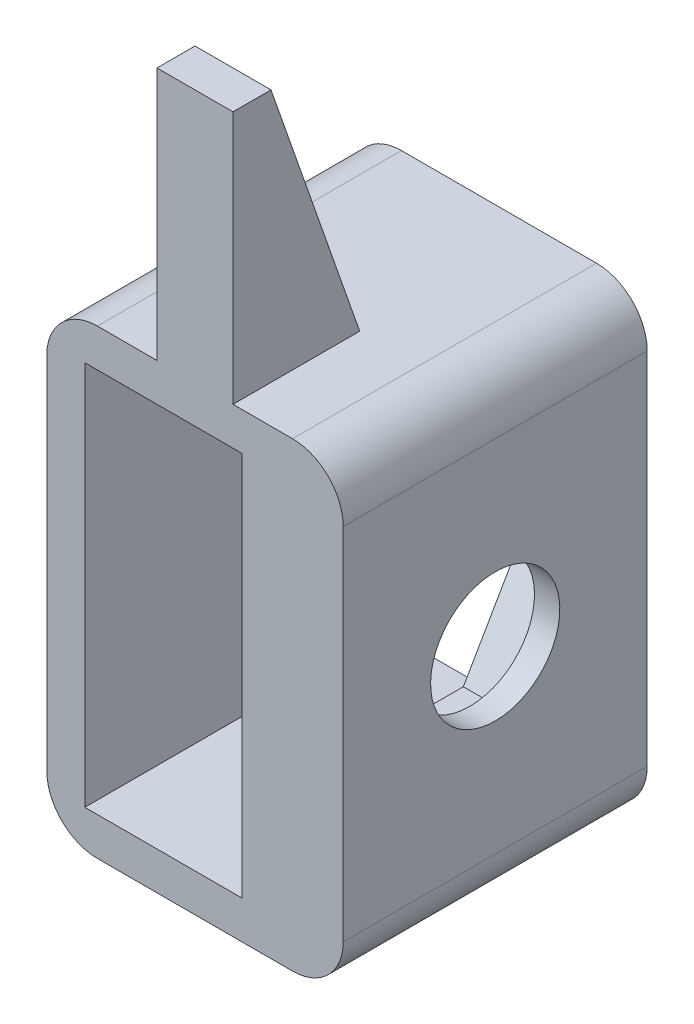
ISO-10303-21;
HEADER;
FILE_DESCRIPTION(('STEP AP214'),'2;1');
FILE_NAME('part.step','',(''),(''),'','','');
FILE_SCHEMA(('AUTOMOTIVE_DESIGN { 1 0 10303 214 1 1 1 1 }'));
ENDSEC;
DATA;
#1=APPLICATION_CONTEXT('core data for automotive mechanical design processes');
#2=APPLICATION_PROTOCOL_DEFINITION('international standard','automotive_design',2000,#1);
#3=PRODUCT_CONTEXT('',#1,'mechanical');
#4=PRODUCT('Part','Part','',(#3));
#5=PRODUCT_RELATED_PRODUCT_CATEGORY('part','',(#4));
#6=PRODUCT_DEFINITION_FORMATION('','',#4);
#7=PRODUCT_DEFINITION_CONTEXT('part definition',#1,'design');
#8=PRODUCT_DEFINITION('design','',#6,#7);
#9=PRODUCT_DEFINITION_SHAPE('','',#8);
#10=(LENGTH_UNIT() NAMED_UNIT(*) SI_UNIT(.MILLI.,.METRE.));
#11=(NAMED_UNIT(*) PLANE_ANGLE_UNIT() SI_UNIT($,.RADIAN.));
#12=(NAMED_UNIT(*) SI_UNIT($,.STERADIAN.) SOLID_ANGLE_UNIT());
#13=UNCERTAINTY_MEASURE_WITH_UNIT(LENGTH_MEASURE(1.E-05),#10,'distance_accuracy_value','');
#14=(GEOMETRIC_REPRESENTATION_CONTEXT(3) GLOBAL_UNCERTAINTY_ASSIGNED_CONTEXT((#13)) GLOBAL_UNIT_ASSIGNED_CONTEXT((#10,
#11,#12)) REPRESENTATION_CONTEXT('',''));
#15=CARTESIAN_POINT('',(0.,0.,0.));
#16=DIRECTION('',(0.,0.,1.));
#17=DIRECTION('',(1.,0.,0.));
#18=AXIS2_PLACEMENT_3D('',#15,#16,#17);
#19=CARTESIAN_POINT('',(-4.6,9.1,12.));
#20=DIRECTION('',(0.,-1.,0.));
#21=DIRECTION('',(1.,0.,0.));
#22=AXIS2_PLACEMENT_3D('',#19,#20,#21);
#23=PLANE('',#22);
#24=DIRECTION('',(1.,0.,0.));
#25=VECTOR('',#24,1.);
#26=CARTESIAN_POINT('',(-4.6,9.1,7.));
#27=LINE('',#26,#25);
#28=CARTESIAN_POINT('',(-0.250000000000001,9.1,7.));
#29=VERTEX_POINT('',#28);
#30=CARTESIAN_POINT('',(2.75,9.1,7.));
#31=VERTEX_POINT('',#30);
#32=EDGE_CURVE('E187',#29,#31,#27,.T.);
#33=ORIENTED_EDGE('',*,*,#32,.T.);
#34=DIRECTION('',(0.,0.,-1.));
#35=VECTOR('',#34,1.);
#36=CARTESIAN_POINT('',(2.75,9.1,12.));
#37=LINE('',#36,#35);
#38=CARTESIAN_POINT('',(2.75,9.1,12.));
#39=VERTEX_POINT('',#38);
#40=EDGE_CURVE('E194',#39,#31,#37,.T.);
#41=ORIENTED_EDGE('',*,*,#40,.F.);
#42=DIRECTION('',(-1.,0.,0.));
#43=VECTOR('',#42,1.);
#44=CARTESIAN_POINT('',(-4.6,9.1,12.));
#45=LINE('',#44,#43);
#46=CARTESIAN_POINT('',(5.1,9.1,12.));
#47=VERTEX_POINT('',#46);
#48=EDGE_CURVE('E316',#47,#39,#45,.T.);
#49=ORIENTED_EDGE('',*,*,#48,.F.);
#50=DIRECTION('',(0.,0.,-1.));
#51=VECTOR('',#50,1.);
#52=CARTESIAN_POINT('',(5.1,9.1,12.));
#53=LINE('',#52,#51);
#54=CARTESIAN_POINT('',(5.1,9.1,0.));
#55=VERTEX_POINT('',#54);
#56=EDGE_CURVE('E11',#47,#55,#53,.T.);
#57=ORIENTED_EDGE('',*,*,#56,.T.);
#58=DIRECTION('',(-1.,0.,0.));
#59=VECTOR('',#58,1.);
#60=CARTESIAN_POINT('',(-4.6,9.1,0.));
#61=LINE('',#60,#59);
#62=CARTESIAN_POINT('',(-2.6,9.1,0.));
#63=VERTEX_POINT('',#62);
#64=EDGE_CURVE('E312',#55,#63,#61,.T.);
#65=ORIENTED_EDGE('',*,*,#64,.T.);
#66=DIRECTION('',(0.,0.,-1.));
#67=VECTOR('',#66,1.);
#68=CARTESIAN_POINT('',(-2.6,9.1,12.));
#69=LINE('',#68,#67);
#70=CARTESIAN_POINT('',(-2.6,9.1,12.));
#71=VERTEX_POINT('',#70);
#72=EDGE_CURVE('E42',#63,#71,#69,.F.);
#73=ORIENTED_EDGE('',*,*,#72,.T.);
#74=CARTESIAN_POINT('',(-0.250000000000001,9.1,12.));
#75=VERTEX_POINT('',#74);
#76=EDGE_CURVE('E188',#75,#71,#45,.T.);
#77=ORIENTED_EDGE('',*,*,#76,.F.);
#78=DIRECTION('',(0.,0.,1.));
#79=VECTOR('',#78,1.);
#80=CARTESIAN_POINT('',(-0.250000000000001,9.1,12.));
#81=LINE('',#80,#79);
#82=EDGE_CURVE('E184',#29,#75,#81,.T.);
#83=ORIENTED_EDGE('',*,*,#82,.F.);
#84=EDGE_LOOP('',(#33,#41,#49,#57,#65,#73,#77,#83));
#85=FACE_BOUND('',#84,.T.);
#86=ADVANCED_FACE('F34',(#85),#23,.F.);
#87=CARTESIAN_POINT('',(0.,0.,12.));
#88=DIRECTION('',(0.,0.,1.));
#89=DIRECTION('',(1.,0.,0.));
#90=AXIS2_PLACEMENT_3D('',#87,#88,#89);
#91=PLANE('',#90);
#92=DIRECTION('',(0.,1.,0.));
#93=VECTOR('',#92,1.);
#94=CARTESIAN_POINT('',(3.1,-7.6,12.));
#95=LINE('',#94,#93);
#96=CARTESIAN_POINT('',(3.1,-7.6,12.));
#97=VERTEX_POINT('',#96);
#98=CARTESIAN_POINT('',(3.1,7.6,12.));
#99=VERTEX_POINT('',#98);
#100=EDGE_CURVE('E277',#97,#99,#95,.T.);
#101=ORIENTED_EDGE('',*,*,#100,.F.);
#102=DIRECTION('',(1.,0.,0.));
#103=VECTOR('',#102,1.);
#104=CARTESIAN_POINT('',(-3.1,-7.6,12.));
#105=LINE('',#104,#103);
#106=CARTESIAN_POINT('',(-3.1,-7.6,12.));
#107=VERTEX_POINT('',#106);
#108=EDGE_CURVE('E285',#107,#97,#105,.T.);
#109=ORIENTED_EDGE('',*,*,#108,.F.);
#110=DIRECTION('',(0.,-1.,0.));
#111=VECTOR('',#110,1.);
#112=CARTESIAN_POINT('',(-3.1,-7.6,12.));
#113=LINE('',#112,#111);
#114=CARTESIAN_POINT('',(-3.1,7.6,12.));
#115=VERTEX_POINT('',#114);
#116=EDGE_CURVE('E282',#115,#107,#113,.T.);
#117=ORIENTED_EDGE('',*,*,#116,.F.);
#118=DIRECTION('',(-1.,0.,0.));
#119=VECTOR('',#118,1.);
#120=CARTESIAN_POINT('',(-3.1,7.6,12.));
#121=LINE('',#120,#119);
#122=EDGE_CURVE('E279',#99,#115,#121,.T.);
#123=ORIENTED_EDGE('',*,*,#122,.F.);
#124=EDGE_LOOP('',(#101,#109,#117,#123));
#125=FACE_BOUND('',#124,.T.);
#126=DIRECTION('',(1.,0.,0.));
#127=VECTOR('',#126,1.);
#128=CARTESIAN_POINT('',(-4.6,-9.1,12.));
#129=LINE('',#128,#127);
#130=CARTESIAN_POINT('',(-2.6,-9.1,12.));
#131=VERTEX_POINT('',#130);
#132=CARTESIAN_POINT('',(5.1,-9.1,12.));
#133=VERTEX_POINT('',#132);
#134=EDGE_CURVE('E311',#131,#133,#129,.T.);
#135=ORIENTED_EDGE('',*,*,#134,.T.);
#136=CARTESIAN_POINT('',(5.1,-7.1,12.));
#137=DIRECTION('',(0.,0.,1.));
#138=DIRECTION('',(1.,0.,0.));
#139=AXIS2_PLACEMENT_3D('',#136,#137,#138);
#140=CIRCLE('',#139,2.);
#141=CARTESIAN_POINT('',(7.1,-7.1,12.));
#142=VERTEX_POINT('',#141);
#143=EDGE_CURVE('E349',#133,#142,#140,.T.);
#144=ORIENTED_EDGE('',*,*,#143,.T.);
#145=DIRECTION('',(0.,1.,0.));
#146=VECTOR('',#145,1.);
#147=CARTESIAN_POINT('',(7.1,9.1,12.));
#148=LINE('',#147,#146);
#149=CARTESIAN_POINT('',(7.1,7.1,12.));
#150=VERTEX_POINT('',#149);
#151=EDGE_CURVE('E314',#142,#150,#148,.T.);
#152=ORIENTED_EDGE('',*,*,#151,.T.);
#153=CARTESIAN_POINT('',(5.1,7.1,12.));
#154=DIRECTION('',(0.,0.,1.));
#155=DIRECTION('',(1.,0.,0.));
#156=AXIS2_PLACEMENT_3D('',#153,#154,#155);
#157=CIRCLE('',#156,2.);
#158=EDGE_CURVE('E56',#150,#47,#157,.T.);
#159=ORIENTED_EDGE('',*,*,#158,.T.);
#160=ORIENTED_EDGE('',*,*,#48,.T.);
#161=DIRECTION('',(0.,-1.,0.));
#162=VECTOR('',#161,1.);
#163=CARTESIAN_POINT('',(2.75,19.1,12.));
#164=LINE('',#163,#162);
#165=CARTESIAN_POINT('',(2.75,19.1,12.));
#166=VERTEX_POINT('',#165);
#167=EDGE_CURVE('E217',#166,#39,#164,.T.);
#168=ORIENTED_EDGE('',*,*,#167,.F.);
#169=DIRECTION('',(1.,0.,0.));
#170=VECTOR('',#169,1.);
#171=CARTESIAN_POINT('',(2.75,19.1,12.));
#172=LINE('',#171,#170);
#173=CARTESIAN_POINT('',(-0.250000000000004,19.1,12.));
#174=VERTEX_POINT('',#173);
#175=EDGE_CURVE('E215',#174,#166,#172,.T.);
#176=ORIENTED_EDGE('',*,*,#175,.F.);
#177=DIRECTION('',(0.,-1.,0.));
#178=VECTOR('',#177,1.);
#179=CARTESIAN_POINT('',(-0.250000000000004,19.1,12.));
#180=LINE('',#179,#178);
#181=EDGE_CURVE('E220',#174,#75,#180,.T.);
#182=ORIENTED_EDGE('',*,*,#181,.T.);
#183=ORIENTED_EDGE('',*,*,#76,.T.);
#184=CARTESIAN_POINT('',(-2.6,7.1,12.));
#185=DIRECTION('',(0.,0.,1.));
#186=DIRECTION('',(1.,0.,0.));
#187=AXIS2_PLACEMENT_3D('',#184,#185,#186);
#188=CIRCLE('',#187,2.);
#189=CARTESIAN_POINT('',(-4.6,7.1,12.));
#190=VERTEX_POINT('',#189);
#191=EDGE_CURVE('E346',#71,#190,#188,.T.);
#192=ORIENTED_EDGE('',*,*,#191,.T.);
#193=DIRECTION('',(0.,-1.,0.));
#194=VECTOR('',#193,1.);
#195=CARTESIAN_POINT('',(-4.6,9.1,12.));
#196=LINE('',#195,#194);
#197=CARTESIAN_POINT('',(-4.6,-7.1,12.));
#198=VERTEX_POINT('',#197);
#199=EDGE_CURVE('E308',#190,#198,#196,.T.);
#200=ORIENTED_EDGE('',*,*,#199,.T.);
#201=CARTESIAN_POINT('',(-2.6,-7.1,12.));
#202=DIRECTION('',(0.,0.,1.));
#203=DIRECTION('',(1.,0.,0.));
#204=AXIS2_PLACEMENT_3D('',#201,#202,#203);
#205=CIRCLE('',#204,2.);
#206=EDGE_CURVE('E351',#198,#131,#205,.T.);
#207=ORIENTED_EDGE('',*,*,#206,.T.);
#208=EDGE_LOOP('',(#135,#144,#152,#159,#160,#168,#176,#182,#183,#192,#200,#207));
#209=FACE_BOUND('',#208,.T.);
#210=ADVANCED_FACE('F374',(#125,#209),#91,.T.);
#211=CARTESIAN_POINT('',(0.,0.,0.));
#212=DIRECTION('',(0.,0.,1.));
#213=DIRECTION('',(1.,0.,0.));
#214=AXIS2_PLACEMENT_3D('',#211,#212,#213);
#215=PLANE('',#214);
#216=DIRECTION('',(1.,0.,0.));
#217=VECTOR('',#216,1.);
#218=CARTESIAN_POINT('',(-4.6,-9.1,0.));
#219=LINE('',#218,#217);
#220=CARTESIAN_POINT('',(-2.6,-9.1,0.));
#221=VERTEX_POINT('',#220);
#222=CARTESIAN_POINT('',(5.1,-9.1,0.));
#223=VERTEX_POINT('',#222);
#224=EDGE_CURVE('E321',#221,#223,#219,.T.);
#225=ORIENTED_EDGE('',*,*,#224,.F.);
#226=CARTESIAN_POINT('',(-2.6,-7.1,0.));
#227=DIRECTION('',(0.,0.,1.));
#228=DIRECTION('',(1.,0.,0.));
#229=AXIS2_PLACEMENT_3D('',#226,#227,#228);
#230=CIRCLE('',#229,2.);
#231=CARTESIAN_POINT('',(-4.6,-7.1,0.));
#232=VERTEX_POINT('',#231);
#233=EDGE_CURVE('E339',#221,#232,#230,.F.);
#234=ORIENTED_EDGE('',*,*,#233,.T.);
#235=DIRECTION('',(0.,-1.,0.));
#236=VECTOR('',#235,1.);
#237=CARTESIAN_POINT('',(-4.6,9.1,0.));
#238=LINE('',#237,#236);
#239=CARTESIAN_POINT('',(-4.6,7.1,0.));
#240=VERTEX_POINT('',#239);
#241=EDGE_CURVE('E307',#240,#232,#238,.T.);
#242=ORIENTED_EDGE('',*,*,#241,.F.);
#243=CARTESIAN_POINT('',(-2.6,7.1,0.));
#244=DIRECTION('',(0.,0.,1.));
#245=DIRECTION('',(1.,0.,0.));
#246=AXIS2_PLACEMENT_3D('',#243,#244,#245);
#247=CIRCLE('',#246,2.);
#248=EDGE_CURVE('E333',#240,#63,#247,.F.);
#249=ORIENTED_EDGE('',*,*,#248,.T.);
#250=ORIENTED_EDGE('',*,*,#64,.F.);
#251=CARTESIAN_POINT('',(5.1,7.1,0.));
#252=DIRECTION('',(0.,0.,1.));
#253=DIRECTION('',(1.,0.,0.));
#254=AXIS2_PLACEMENT_3D('',#251,#252,#253);
#255=CIRCLE('',#254,2.);
#256=CARTESIAN_POINT('',(7.1,7.1,0.));
#257=VERTEX_POINT('',#256);
#258=EDGE_CURVE('E335',#55,#257,#255,.F.);
#259=ORIENTED_EDGE('',*,*,#258,.T.);
#260=DIRECTION('',(0.,1.,0.));
#261=VECTOR('',#260,1.);
#262=CARTESIAN_POINT('',(7.1,9.1,0.));
#263=LINE('',#262,#261);
#264=CARTESIAN_POINT('',(7.1,-7.1,0.));
#265=VERTEX_POINT('',#264);
#266=EDGE_CURVE('E324',#265,#257,#263,.T.);
#267=ORIENTED_EDGE('',*,*,#266,.F.);
#268=CARTESIAN_POINT('',(5.1,-7.1,0.));
#269=DIRECTION('',(0.,0.,1.));
#270=DIRECTION('',(1.,0.,0.));
#271=AXIS2_PLACEMENT_3D('',#268,#269,#270);
#272=CIRCLE('',#271,2.);
#273=EDGE_CURVE('E337',#265,#223,#272,.F.);
#274=ORIENTED_EDGE('',*,*,#273,.T.);
#275=EDGE_LOOP('',(#225,#234,#242,#249,#250,#259,#267,#274));
#276=FACE_BOUND('',#275,.T.);
#277=DIRECTION('',(0.,1.,0.));
#278=VECTOR('',#277,1.);
#279=CARTESIAN_POINT('',(3.1,-7.6,0.));
#280=LINE('',#279,#278);
#281=CARTESIAN_POINT('',(3.1,-7.6,0.));
#282=VERTEX_POINT('',#281);
#283=CARTESIAN_POINT('',(3.1,7.6,0.));
#284=VERTEX_POINT('',#283);
#285=EDGE_CURVE('E266',#282,#284,#280,.T.);
#286=ORIENTED_EDGE('',*,*,#285,.T.);
#287=DIRECTION('',(-1.,0.,0.));
#288=VECTOR('',#287,1.);
#289=CARTESIAN_POINT('',(-3.1,7.6,0.));
#290=LINE('',#289,#288);
#291=CARTESIAN_POINT('',(-3.1,7.6,0.));
#292=VERTEX_POINT('',#291);
#293=EDGE_CURVE('E290',#284,#292,#290,.T.);
#294=ORIENTED_EDGE('',*,*,#293,.T.);
#295=DIRECTION('',(0.,-1.,0.));
#296=VECTOR('',#295,1.);
#297=CARTESIAN_POINT('',(-3.1,-7.6,0.));
#298=LINE('',#297,#296);
#299=CARTESIAN_POINT('',(-3.1,-7.6,0.));
#300=VERTEX_POINT('',#299);
#301=EDGE_CURVE('E293',#292,#300,#298,.T.);
#302=ORIENTED_EDGE('',*,*,#301,.T.);
#303=DIRECTION('',(1.,0.,0.));
#304=VECTOR('',#303,1.);
#305=CARTESIAN_POINT('',(-3.1,-7.6,0.));
#306=LINE('',#305,#304);
#307=EDGE_CURVE('E280',#300,#282,#306,.T.);
#308=ORIENTED_EDGE('',*,*,#307,.T.);
#309=EDGE_LOOP('',(#286,#294,#302,#308));
#310=FACE_BOUND('',#309,.T.);
#311=ADVANCED_FACE('F367',(#276,#310),#215,.F.);
#312=CARTESIAN_POINT('',(-4.6,9.1,12.));
#313=DIRECTION('',(1.,0.,0.));
#314=DIRECTION('',(0.,1.,0.));
#315=AXIS2_PLACEMENT_3D('',#312,#313,#314);
#316=PLANE('',#315);
#317=ORIENTED_EDGE('',*,*,#241,.T.);
#318=DIRECTION('',(0.,0.,-1.));
#319=VECTOR('',#318,1.);
#320=CARTESIAN_POINT('',(-4.6,-7.1,12.));
#321=LINE('',#320,#319);
#322=EDGE_CURVE('E344',#232,#198,#321,.F.);
#323=ORIENTED_EDGE('',*,*,#322,.T.);
#324=ORIENTED_EDGE('',*,*,#199,.F.);
#325=DIRECTION('',(0.,0.,-1.));
#326=VECTOR('',#325,1.);
#327=CARTESIAN_POINT('',(-4.6,7.1,12.));
#328=LINE('',#327,#326);
#329=EDGE_CURVE('E341',#190,#240,#328,.T.);
#330=ORIENTED_EDGE('',*,*,#329,.T.);
#331=EDGE_LOOP('',(#317,#323,#324,#330));
#332=FACE_BOUND('',#331,.T.);
#333=ADVANCED_FACE('F387',(#332),#316,.F.);
#334=CARTESIAN_POINT('',(-4.6,-9.1,12.));
#335=DIRECTION('',(0.,1.,0.));
#336=DIRECTION('',(0.,0.,1.));
#337=AXIS2_PLACEMENT_3D('',#334,#335,#336);
#338=PLANE('',#337);
#339=DIRECTION('',(0.,0.,-1.));
#340=VECTOR('',#339,1.);
#341=CARTESIAN_POINT('',(5.1,-9.1,12.));
#342=LINE('',#341,#340);
#343=EDGE_CURVE('E318',#223,#133,#342,.F.);
#344=ORIENTED_EDGE('',*,*,#343,.T.);
#345=ORIENTED_EDGE('',*,*,#134,.F.);
#346=DIRECTION('',(0.,0.,-1.));
#347=VECTOR('',#346,1.);
#348=CARTESIAN_POINT('',(-2.6,-9.1,12.));
#349=LINE('',#348,#347);
#350=EDGE_CURVE('E330',#131,#221,#349,.T.);
#351=ORIENTED_EDGE('',*,*,#350,.T.);
#352=ORIENTED_EDGE('',*,*,#224,.T.);
#353=EDGE_LOOP('',(#344,#345,#351,#352));
#354=FACE_BOUND('',#353,.T.);
#355=ADVANCED_FACE('F395',(#354),#338,.F.);
#356=CARTESIAN_POINT('',(7.1,9.1,12.));
#357=DIRECTION('',(-1.,0.,0.));
#358=DIRECTION('',(0.,-1.,0.));
#359=AXIS2_PLACEMENT_3D('',#356,#357,#358);
#360=PLANE('',#359);
#361=CARTESIAN_POINT('',(7.1,0.,6.));
#362=DIRECTION('',(-1.,0.,0.));
#363=DIRECTION('',(0.,-1.,0.));
#364=AXIS2_PLACEMENT_3D('',#361,#362,#363);
#365=CIRCLE('',#364,2.55);
#366=CARTESIAN_POINT('',(7.1,-2.55,6.));
#367=VERTEX_POINT('',#366);
#368=EDGE_CURVE('E222',#367,#367,#365,.T.);
#369=ORIENTED_EDGE('',*,*,#368,.T.);
#370=EDGE_LOOP('',(#369));
#371=FACE_BOUND('',#370,.T.);
#372=ORIENTED_EDGE('',*,*,#151,.F.);
#373=DIRECTION('',(0.,0.,-1.));
#374=VECTOR('',#373,1.);
#375=CARTESIAN_POINT('',(7.1,-7.1,12.));
#376=LINE('',#375,#374);
#377=EDGE_CURVE('E355',#142,#265,#376,.T.);
#378=ORIENTED_EDGE('',*,*,#377,.T.);
#379=ORIENTED_EDGE('',*,*,#266,.T.);
#380=DIRECTION('',(0.,0.,-1.));
#381=VECTOR('',#380,1.);
#382=CARTESIAN_POINT('',(7.1,7.1,12.));
#383=LINE('',#382,#381);
#384=EDGE_CURVE('E353',#257,#150,#383,.F.);
#385=ORIENTED_EDGE('',*,*,#384,.T.);
#386=EDGE_LOOP('',(#372,#378,#379,#385));
#387=FACE_BOUND('',#386,.T.);
#388=ADVANCED_FACE('F361',(#371,#387),#360,.F.);
#389=CARTESIAN_POINT('',(3.1,-7.6,12.));
#390=DIRECTION('',(-1.,0.,0.));
#391=DIRECTION('',(0.,-1.,0.));
#392=AXIS2_PLACEMENT_3D('',#389,#390,#391);
#393=PLANE('',#392);
#394=DIRECTION('',(0.,-0.866025403784439,-0.5));
#395=VECTOR('',#394,1.);
#396=CARTESIAN_POINT('',(3.1,4.75,3.25758622134927));
#397=LINE('',#396,#395);
#398=CARTESIAN_POINT('',(3.1,4.75,3.25758622134927));
#399=VERTEX_POINT('',#398);
#400=CARTESIAN_POINT('',(3.1,0.,0.515172442698557));
#401=VERTEX_POINT('',#400);
#402=EDGE_CURVE('E228',#399,#401,#397,.T.);
#403=ORIENTED_EDGE('',*,*,#402,.F.);
#404=DIRECTION('',(0.,0.,-1.));
#405=VECTOR('',#404,1.);
#406=CARTESIAN_POINT('',(3.1,4.75,8.74241377865072));
#407=LINE('',#406,#405);
#408=CARTESIAN_POINT('',(3.1,4.75,8.74241377865072));
#409=VERTEX_POINT('',#408);
#410=EDGE_CURVE('E233',#409,#399,#407,.T.);
#411=ORIENTED_EDGE('',*,*,#410,.F.);
#412=DIRECTION('',(0.,0.866025403784439,-0.5));
#413=VECTOR('',#412,1.);
#414=CARTESIAN_POINT('',(3.1,0.,11.4848275573014));
#415=LINE('',#414,#413);
#416=CARTESIAN_POINT('',(3.1,0.,11.4848275573014));
#417=VERTEX_POINT('',#416);
#418=EDGE_CURVE('E259',#417,#409,#415,.T.);
#419=ORIENTED_EDGE('',*,*,#418,.F.);
#420=DIRECTION('',(0.,0.866025403784439,0.5));
#421=VECTOR('',#420,1.);
#422=CARTESIAN_POINT('',(3.1,-4.75,8.74241377865072));
#423=LINE('',#422,#421);
#424=CARTESIAN_POINT('',(3.1,-4.75,8.74241377865072));
#425=VERTEX_POINT('',#424);
#426=EDGE_CURVE('E256',#425,#417,#423,.T.);
#427=ORIENTED_EDGE('',*,*,#426,.F.);
#428=DIRECTION('',(0.,0.,1.));
#429=VECTOR('',#428,1.);
#430=CARTESIAN_POINT('',(3.1,-4.75,3.25758622134928));
#431=LINE('',#430,#429);
#432=CARTESIAN_POINT('',(3.1,-4.75,3.25758622134928));
#433=VERTEX_POINT('',#432);
#434=EDGE_CURVE('E253',#433,#425,#431,.T.);
#435=ORIENTED_EDGE('',*,*,#434,.F.);
#436=DIRECTION('',(0.,-0.866025403784439,0.5));
#437=VECTOR('',#436,1.);
#438=CARTESIAN_POINT('',(3.1,0.,0.515172442698555));
#439=LINE('',#438,#437);
#440=EDGE_CURVE('E250',#401,#433,#439,.T.);
#441=ORIENTED_EDGE('',*,*,#440,.F.);
#442=EDGE_LOOP('',(#403,#411,#419,#427,#435,#441));
#443=FACE_BOUND('',#442,.T.);
#444=ORIENTED_EDGE('',*,*,#285,.F.);
#445=DIRECTION('',(0.,0.,-1.));
#446=VECTOR('',#445,1.);
#447=CARTESIAN_POINT('',(3.1,-7.6,12.));
#448=LINE('',#447,#446);
#449=EDGE_CURVE('E287',#97,#282,#448,.T.);
#450=ORIENTED_EDGE('',*,*,#449,.F.);
#451=ORIENTED_EDGE('',*,*,#100,.T.);
#452=DIRECTION('',(0.,0.,-1.));
#453=VECTOR('',#452,1.);
#454=CARTESIAN_POINT('',(3.1,7.6,12.));
#455=LINE('',#454,#453);
#456=EDGE_CURVE('E304',#99,#284,#455,.T.);
#457=ORIENTED_EDGE('',*,*,#456,.T.);
#458=EDGE_LOOP('',(#444,#450,#451,#457));
#459=FACE_BOUND('',#458,.T.);
#460=ADVANCED_FACE('F416',(#443,#459),#393,.T.);
#461=CARTESIAN_POINT('',(-3.1,7.6,12.));
#462=DIRECTION('',(0.,-1.,0.));
#463=DIRECTION('',(0.,0.,-1.));
#464=AXIS2_PLACEMENT_3D('',#461,#462,#463);
#465=PLANE('',#464);
#466=ORIENTED_EDGE('',*,*,#122,.T.);
#467=DIRECTION('',(0.,0.,-1.));
#468=VECTOR('',#467,1.);
#469=CARTESIAN_POINT('',(-3.1,7.6,12.));
#470=LINE('',#469,#468);
#471=EDGE_CURVE('E302',#115,#292,#470,.T.);
#472=ORIENTED_EDGE('',*,*,#471,.T.);
#473=ORIENTED_EDGE('',*,*,#293,.F.);
#474=ORIENTED_EDGE('',*,*,#456,.F.);
#475=EDGE_LOOP('',(#466,#472,#473,#474));
#476=FACE_BOUND('',#475,.T.);
#477=ADVANCED_FACE('F449',(#476),#465,.T.);
#478=CARTESIAN_POINT('',(-3.1,-7.6,12.));
#479=DIRECTION('',(1.,0.,0.));
#480=DIRECTION('',(0.,1.,0.));
#481=AXIS2_PLACEMENT_3D('',#478,#479,#480);
#482=PLANE('',#481);
#483=ORIENTED_EDGE('',*,*,#301,.F.);
#484=ORIENTED_EDGE('',*,*,#471,.F.);
#485=ORIENTED_EDGE('',*,*,#116,.T.);
#486=DIRECTION('',(0.,0.,-1.));
#487=VECTOR('',#486,1.);
#488=CARTESIAN_POINT('',(-3.1,-7.6,12.));
#489=LINE('',#488,#487);
#490=EDGE_CURVE('E300',#107,#300,#489,.T.);
#491=ORIENTED_EDGE('',*,*,#490,.T.);
#492=EDGE_LOOP('',(#483,#484,#485,#491));
#493=FACE_BOUND('',#492,.T.);
#494=ADVANCED_FACE('F454',(#493),#482,.T.);
#495=CARTESIAN_POINT('',(-3.1,-7.6,12.));
#496=DIRECTION('',(0.,1.,0.));
#497=DIRECTION('',(0.,0.,1.));
#498=AXIS2_PLACEMENT_3D('',#495,#496,#497);
#499=PLANE('',#498);
#500=ORIENTED_EDGE('',*,*,#108,.T.);
#501=ORIENTED_EDGE('',*,*,#449,.T.);
#502=ORIENTED_EDGE('',*,*,#307,.F.);
#503=ORIENTED_EDGE('',*,*,#490,.F.);
#504=EDGE_LOOP('',(#500,#501,#502,#503));
#505=FACE_BOUND('',#504,.T.);
#506=ADVANCED_FACE('F464',(#505),#499,.T.);
#507=CARTESIAN_POINT('',(6.1,4.75,3.25758622134927));
#508=DIRECTION('',(0.,0.5,-0.866025403784439));
#509=DIRECTION('',(0.,0.866025403784439,0.5));
#510=AXIS2_PLACEMENT_3D('',#507,#508,#509);
#511=PLANE('',#510);
#512=ORIENTED_EDGE('',*,*,#402,.T.);
#513=DIRECTION('',(-1.,0.,0.));
#514=VECTOR('',#513,1.);
#515=CARTESIAN_POINT('',(6.1,0.,0.515172442698555));
#516=LINE('',#515,#514);
#517=CARTESIAN_POINT('',(6.1,0.,0.515172442698555));
#518=VERTEX_POINT('',#517);
#519=EDGE_CURVE('E248',#518,#401,#516,.T.);
#520=ORIENTED_EDGE('',*,*,#519,.F.);
#521=DIRECTION('',(0.,-0.866025403784439,-0.5));
#522=VECTOR('',#521,1.);
#523=CARTESIAN_POINT('',(6.1,4.75,3.25758622134927));
#524=LINE('',#523,#522);
#525=CARTESIAN_POINT('',(6.1,4.75,3.25758622134927));
#526=VERTEX_POINT('',#525);
#527=EDGE_CURVE('E229',#526,#518,#524,.T.);
#528=ORIENTED_EDGE('',*,*,#527,.F.);
#529=DIRECTION('',(-1.,0.,0.));
#530=VECTOR('',#529,1.);
#531=CARTESIAN_POINT('',(6.1,4.75,3.25758622134927));
#532=LINE('',#531,#530);
#533=EDGE_CURVE('E264',#526,#399,#532,.T.);
#534=ORIENTED_EDGE('',*,*,#533,.T.);
#535=EDGE_LOOP('',(#512,#520,#528,#534));
#536=FACE_BOUND('',#535,.T.);
#537=ADVANCED_FACE('F469',(#536),#511,.F.);
#538=CARTESIAN_POINT('',(6.1,4.75,8.74241377865072));
#539=DIRECTION('',(0.,1.,0.));
#540=DIRECTION('',(-1.,0.,0.));
#541=AXIS2_PLACEMENT_3D('',#538,#539,#540);
#542=PLANE('',#541);
#543=ORIENTED_EDGE('',*,*,#410,.T.);
#544=ORIENTED_EDGE('',*,*,#533,.F.);
#545=DIRECTION('',(0.,0.,-1.));
#546=VECTOR('',#545,1.);
#547=CARTESIAN_POINT('',(6.1,4.75,8.74241377865072));
#548=LINE('',#547,#546);
#549=CARTESIAN_POINT('',(6.1,4.75,8.74241377865072));
#550=VERTEX_POINT('',#549);
#551=EDGE_CURVE('E245',#550,#526,#548,.T.);
#552=ORIENTED_EDGE('',*,*,#551,.F.);
#553=DIRECTION('',(-1.,0.,0.));
#554=VECTOR('',#553,1.);
#555=CARTESIAN_POINT('',(6.1,4.75,8.74241377865072));
#556=LINE('',#555,#554);
#557=EDGE_CURVE('E267',#550,#409,#556,.T.);
#558=ORIENTED_EDGE('',*,*,#557,.T.);
#559=EDGE_LOOP('',(#543,#544,#552,#558));
#560=FACE_BOUND('',#559,.T.);
#561=ADVANCED_FACE('F555',(#560),#542,.F.);
#562=CARTESIAN_POINT('',(6.1,0.,11.4848275573014));
#563=DIRECTION('',(0.,0.5,0.866025403784438));
#564=DIRECTION('',(0.,-0.866025403784439,0.5));
#565=AXIS2_PLACEMENT_3D('',#562,#563,#564);
#566=PLANE('',#565);
#567=ORIENTED_EDGE('',*,*,#418,.T.);
#568=ORIENTED_EDGE('',*,*,#557,.F.);
#569=DIRECTION('',(0.,0.866025403784439,-0.5));
#570=VECTOR('',#569,1.);
#571=CARTESIAN_POINT('',(6.1,0.,11.4848275573014));
#572=LINE('',#571,#570);
#573=CARTESIAN_POINT('',(6.1,0.,11.4848275573014));
#574=VERTEX_POINT('',#573);
#575=EDGE_CURVE('E242',#574,#550,#572,.T.);
#576=ORIENTED_EDGE('',*,*,#575,.F.);
#577=DIRECTION('',(-1.,0.,0.));
#578=VECTOR('',#577,1.);
#579=CARTESIAN_POINT('',(6.1,0.,11.4848275573014));
#580=LINE('',#579,#578);
#581=EDGE_CURVE('E269',#574,#417,#580,.T.);
#582=ORIENTED_EDGE('',*,*,#581,.T.);
#583=EDGE_LOOP('',(#567,#568,#576,#582));
#584=FACE_BOUND('',#583,.T.);
#585=ADVANCED_FACE('F565',(#584),#566,.F.);
#586=CARTESIAN_POINT('',(6.1,-4.75,8.74241377865072));
#587=DIRECTION('',(0.,-0.5,0.866025403784439));
#588=DIRECTION('',(0.,-0.866025403784439,-0.5));
#589=AXIS2_PLACEMENT_3D('',#586,#587,#588);
#590=PLANE('',#589);
#591=ORIENTED_EDGE('',*,*,#426,.T.);
#592=ORIENTED_EDGE('',*,*,#581,.F.);
#593=DIRECTION('',(0.,0.866025403784439,0.5));
#594=VECTOR('',#593,1.);
#595=CARTESIAN_POINT('',(6.1,-4.75,8.74241377865072));
#596=LINE('',#595,#594);
#597=CARTESIAN_POINT('',(6.1,-4.75,8.74241377865072));
#598=VERTEX_POINT('',#597);
#599=EDGE_CURVE('E239',#598,#574,#596,.T.);
#600=ORIENTED_EDGE('',*,*,#599,.F.);
#601=DIRECTION('',(-1.,0.,0.));
#602=VECTOR('',#601,1.);
#603=CARTESIAN_POINT('',(6.1,-4.75,8.74241377865072));
#604=LINE('',#603,#602);
#605=EDGE_CURVE('E271',#598,#425,#604,.T.);
#606=ORIENTED_EDGE('',*,*,#605,.T.);
#607=EDGE_LOOP('',(#591,#592,#600,#606));
#608=FACE_BOUND('',#607,.T.);
#609=ADVANCED_FACE('F575',(#608),#590,.F.);
#610=CARTESIAN_POINT('',(6.1,-4.75,3.25758622134928));
#611=DIRECTION('',(0.,-1.,0.));
#612=DIRECTION('',(0.,0.,-1.));
#613=AXIS2_PLACEMENT_3D('',#610,#611,#612);
#614=PLANE('',#613);
#615=ORIENTED_EDGE('',*,*,#434,.T.);
#616=ORIENTED_EDGE('',*,*,#605,.F.);
#617=DIRECTION('',(0.,0.,1.));
#618=VECTOR('',#617,1.);
#619=CARTESIAN_POINT('',(6.1,-4.75,3.25758622134928));
#620=LINE('',#619,#618);
#621=CARTESIAN_POINT('',(6.1,-4.75,3.25758622134928));
#622=VERTEX_POINT('',#621);
#623=EDGE_CURVE('E236',#622,#598,#620,.T.);
#624=ORIENTED_EDGE('',*,*,#623,.F.);
#625=DIRECTION('',(-1.,0.,0.));
#626=VECTOR('',#625,1.);
#627=CARTESIAN_POINT('',(6.1,-4.75,3.25758622134928));
#628=LINE('',#627,#626);
#629=EDGE_CURVE('E273',#622,#433,#628,.T.);
#630=ORIENTED_EDGE('',*,*,#629,.T.);
#631=EDGE_LOOP('',(#615,#616,#624,#630));
#632=FACE_BOUND('',#631,.T.);
#633=ADVANCED_FACE('F585',(#632),#614,.F.);
#634=CARTESIAN_POINT('',(6.1,0.,0.515172442698555));
#635=DIRECTION('',(0.,-0.5,-0.866025403784439));
#636=DIRECTION('',(0.,0.866025403784439,-0.5));
#637=AXIS2_PLACEMENT_3D('',#634,#635,#636);
#638=PLANE('',#637);
#639=ORIENTED_EDGE('',*,*,#440,.T.);
#640=ORIENTED_EDGE('',*,*,#629,.F.);
#641=DIRECTION('',(0.,-0.866025403784439,0.5));
#642=VECTOR('',#641,1.);
#643=CARTESIAN_POINT('',(6.1,0.,0.515172442698555));
#644=LINE('',#643,#642);
#645=EDGE_CURVE('E232',#518,#622,#644,.T.);
#646=ORIENTED_EDGE('',*,*,#645,.F.);
#647=ORIENTED_EDGE('',*,*,#519,.T.);
#648=EDGE_LOOP('',(#639,#640,#646,#647));
#649=FACE_BOUND('',#648,.T.);
#650=ADVANCED_FACE('F595',(#649),#638,.F.);
#651=CARTESIAN_POINT('',(6.1,0.,0.));
#652=DIRECTION('',(-1.,0.,0.));
#653=DIRECTION('',(0.,-1.,0.));
#654=AXIS2_PLACEMENT_3D('',#651,#652,#653);
#655=PLANE('',#654);
#656=CARTESIAN_POINT('',(6.1,0.,6.));
#657=DIRECTION('',(-1.,0.,0.));
#658=DIRECTION('',(0.,-1.,0.));
#659=AXIS2_PLACEMENT_3D('',#656,#657,#658);
#660=CIRCLE('',#659,2.55);
#661=CARTESIAN_POINT('',(6.1,-2.55,6.));
#662=VERTEX_POINT('',#661);
#663=EDGE_CURVE('E225',#662,#662,#660,.T.);
#664=ORIENTED_EDGE('',*,*,#663,.F.);
#665=EDGE_LOOP('',(#664));
#666=FACE_BOUND('',#665,.T.);
#667=ORIENTED_EDGE('',*,*,#527,.T.);
#668=ORIENTED_EDGE('',*,*,#645,.T.);
#669=ORIENTED_EDGE('',*,*,#623,.T.);
#670=ORIENTED_EDGE('',*,*,#599,.T.);
#671=ORIENTED_EDGE('',*,*,#575,.T.);
#672=ORIENTED_EDGE('',*,*,#551,.T.);
#673=EDGE_LOOP('',(#667,#668,#669,#670,#671,#672));
#674=FACE_BOUND('',#673,.T.);
#675=ADVANCED_FACE('F605',(#666,#674),#655,.T.);
#676=CARTESIAN_POINT('',(7.1,0.,6.));
#677=DIRECTION('',(-1.,0.,0.));
#678=DIRECTION('',(0.,-1.,0.));
#679=AXIS2_PLACEMENT_3D('',#676,#677,#678);
#680=CYLINDRICAL_SURFACE('',#679,2.55);
#681=ORIENTED_EDGE('',*,*,#663,.T.);
#682=EDGE_LOOP('',(#681));
#683=FACE_BOUND('',#682,.T.);
#684=ORIENTED_EDGE('',*,*,#368,.F.);
#685=EDGE_LOOP('',(#684));
#686=FACE_BOUND('',#685,.T.);
#687=ADVANCED_FACE('F481',(#683,#686),#680,.F.);
#688=CARTESIAN_POINT('',(2.75,19.1,12.));
#689=DIRECTION('',(-1.,0.,0.));
#690=DIRECTION('',(0.,-1.,0.));
#691=AXIS2_PLACEMENT_3D('',#688,#689,#690);
#692=PLANE('',#691);
#693=ORIENTED_EDGE('',*,*,#167,.T.);
#694=ORIENTED_EDGE('',*,*,#40,.T.);
#695=DIRECTION('',(0.,0.943858356366017,0.330350424728106));
#696=VECTOR('',#695,1.);
#697=CARTESIAN_POINT('',(2.75,9.1,7.));
#698=LINE('',#697,#696);
#699=CARTESIAN_POINT('',(2.75,19.1,10.5));
#700=VERTEX_POINT('',#699);
#701=EDGE_CURVE('E202',#31,#700,#698,.T.);
#702=ORIENTED_EDGE('',*,*,#701,.T.);
#703=DIRECTION('',(0.,0.,-1.));
#704=VECTOR('',#703,1.);
#705=CARTESIAN_POINT('',(2.75,19.1,12.));
#706=LINE('',#705,#704);
#707=EDGE_CURVE('E193',#166,#700,#706,.T.);
#708=ORIENTED_EDGE('',*,*,#707,.F.);
#709=EDGE_LOOP('',(#693,#694,#702,#708));
#710=FACE_BOUND('',#709,.T.);
#711=ADVANCED_FACE('F378',(#710),#692,.F.);
#712=CARTESIAN_POINT('',(-0.250000000000004,19.1,12.));
#713=DIRECTION('',(1.,0.,0.));
#714=DIRECTION('',(0.,1.,0.));
#715=AXIS2_PLACEMENT_3D('',#712,#713,#714);
#716=PLANE('',#715);
#717=ORIENTED_EDGE('',*,*,#82,.T.);
#718=ORIENTED_EDGE('',*,*,#181,.F.);
#719=DIRECTION('',(0.,0.,1.));
#720=VECTOR('',#719,1.);
#721=CARTESIAN_POINT('',(-0.250000000000004,19.1,12.));
#722=LINE('',#721,#720);
#723=CARTESIAN_POINT('',(-0.250000000000004,19.1,10.5));
#724=VERTEX_POINT('',#723);
#725=EDGE_CURVE('E206',#724,#174,#722,.T.);
#726=ORIENTED_EDGE('',*,*,#725,.F.);
#727=DIRECTION('',(0.,0.943858356366017,0.330350424728106));
#728=VECTOR('',#727,1.);
#729=CARTESIAN_POINT('',(-0.250000000000001,9.1,7.));
#730=LINE('',#729,#728);
#731=EDGE_CURVE('E199',#29,#724,#730,.T.);
#732=ORIENTED_EDGE('',*,*,#731,.F.);
#733=EDGE_LOOP('',(#717,#718,#726,#732));
#734=FACE_BOUND('',#733,.T.);
#735=ADVANCED_FACE('F205',(#734),#716,.F.);
#736=CARTESIAN_POINT('',(0.,19.1,0.));
#737=DIRECTION('',(0.,1.,0.));
#738=DIRECTION('',(0.,0.,1.));
#739=AXIS2_PLACEMENT_3D('',#736,#737,#738);
#740=PLANE('',#739);
#741=ORIENTED_EDGE('',*,*,#707,.T.);
#742=DIRECTION('',(-1.,0.,0.));
#743=VECTOR('',#742,1.);
#744=CARTESIAN_POINT('',(2.75,19.1,10.5));
#745=LINE('',#744,#743);
#746=EDGE_CURVE('E212',#700,#724,#745,.T.);
#747=ORIENTED_EDGE('',*,*,#746,.T.);
#748=ORIENTED_EDGE('',*,*,#725,.T.);
#749=ORIENTED_EDGE('',*,*,#175,.T.);
#750=EDGE_LOOP('',(#741,#747,#748,#749));
#751=FACE_BOUND('',#750,.T.);
#752=ADVANCED_FACE('F380',(#751),#740,.T.);
#753=CARTESIAN_POINT('',(-2.6,-7.1,12.));
#754=DIRECTION('',(0.,0.,-1.));
#755=DIRECTION('',(-1.,0.,0.));
#756=AXIS2_PLACEMENT_3D('',#753,#754,#755);
#757=CYLINDRICAL_SURFACE('',#756,2.);
#758=ORIENTED_EDGE('',*,*,#206,.F.);
#759=ORIENTED_EDGE('',*,*,#322,.F.);
#760=ORIENTED_EDGE('',*,*,#233,.F.);
#761=ORIENTED_EDGE('',*,*,#350,.F.);
#762=EDGE_LOOP('',(#758,#759,#760,#761));
#763=FACE_BOUND('',#762,.T.);
#764=ADVANCED_FACE('F392',(#763),#757,.T.);
#765=CARTESIAN_POINT('',(5.1,-7.1,12.));
#766=DIRECTION('',(0.,0.,-1.));
#767=DIRECTION('',(-1.,0.,0.));
#768=AXIS2_PLACEMENT_3D('',#765,#766,#767);
#769=CYLINDRICAL_SURFACE('',#768,2.);
#770=ORIENTED_EDGE('',*,*,#143,.F.);
#771=ORIENTED_EDGE('',*,*,#343,.F.);
#772=ORIENTED_EDGE('',*,*,#273,.F.);
#773=ORIENTED_EDGE('',*,*,#377,.F.);
#774=EDGE_LOOP('',(#770,#771,#772,#773));
#775=FACE_BOUND('',#774,.T.);
#776=ADVANCED_FACE('F397',(#775),#769,.T.);
#777=CARTESIAN_POINT('',(5.1,7.1,12.));
#778=DIRECTION('',(0.,0.,-1.));
#779=DIRECTION('',(-1.,0.,0.));
#780=AXIS2_PLACEMENT_3D('',#777,#778,#779);
#781=CYLINDRICAL_SURFACE('',#780,2.);
#782=ORIENTED_EDGE('',*,*,#158,.F.);
#783=ORIENTED_EDGE('',*,*,#384,.F.);
#784=ORIENTED_EDGE('',*,*,#258,.F.);
#785=ORIENTED_EDGE('',*,*,#56,.F.);
#786=EDGE_LOOP('',(#782,#783,#784,#785));
#787=FACE_BOUND('',#786,.T.);
#788=ADVANCED_FACE('F372',(#787),#781,.T.);
#789=CARTESIAN_POINT('',(-2.6,7.1,12.));
#790=DIRECTION('',(0.,0.,-1.));
#791=DIRECTION('',(-1.,0.,0.));
#792=AXIS2_PLACEMENT_3D('',#789,#790,#791);
#793=CYLINDRICAL_SURFACE('',#792,2.);
#794=ORIENTED_EDGE('',*,*,#191,.F.);
#795=ORIENTED_EDGE('',*,*,#72,.F.);
#796=ORIENTED_EDGE('',*,*,#248,.F.);
#797=ORIENTED_EDGE('',*,*,#329,.F.);
#798=EDGE_LOOP('',(#794,#795,#796,#797));
#799=FACE_BOUND('',#798,.T.);
#800=ADVANCED_FACE('F36',(#799),#793,.T.);
#801=CARTESIAN_POINT('',(1.25,9.1,7.));
#802=DIRECTION('',(0.,0.330350424728106,-0.943858356366017));
#803=DIRECTION('',(0.,0.943858356366017,0.330350424728106));
#804=AXIS2_PLACEMENT_3D('',#801,#802,#803);
#805=PLANE('',#804);
#806=ORIENTED_EDGE('',*,*,#32,.F.);
#807=ORIENTED_EDGE('',*,*,#731,.T.);
#808=ORIENTED_EDGE('',*,*,#746,.F.);
#809=ORIENTED_EDGE('',*,*,#701,.F.);
#810=EDGE_LOOP('',(#806,#807,#808,#809));
#811=FACE_BOUND('',#810,.T.);
#812=ADVANCED_FACE('F198',(#811),#805,.T.);
#813=CLOSED_SHELL('',(#86,#210,#311,#333,#355,#388,#460,#477,#494,#506,#537,#561,#585,#609,#633,
#650,#675,#687,#711,#735,#752,#764,#776,#788,#800,#812));
#814=MANIFOLD_SOLID_BREP('B2',#813);
#815=ADVANCED_BREP_SHAPE_REPRESENTATION('',(#18,#814),#14);
#816=SHAPE_DEFINITION_REPRESENTATION(#9,#815);
ENDSEC;
END-ISO-10303-21;
